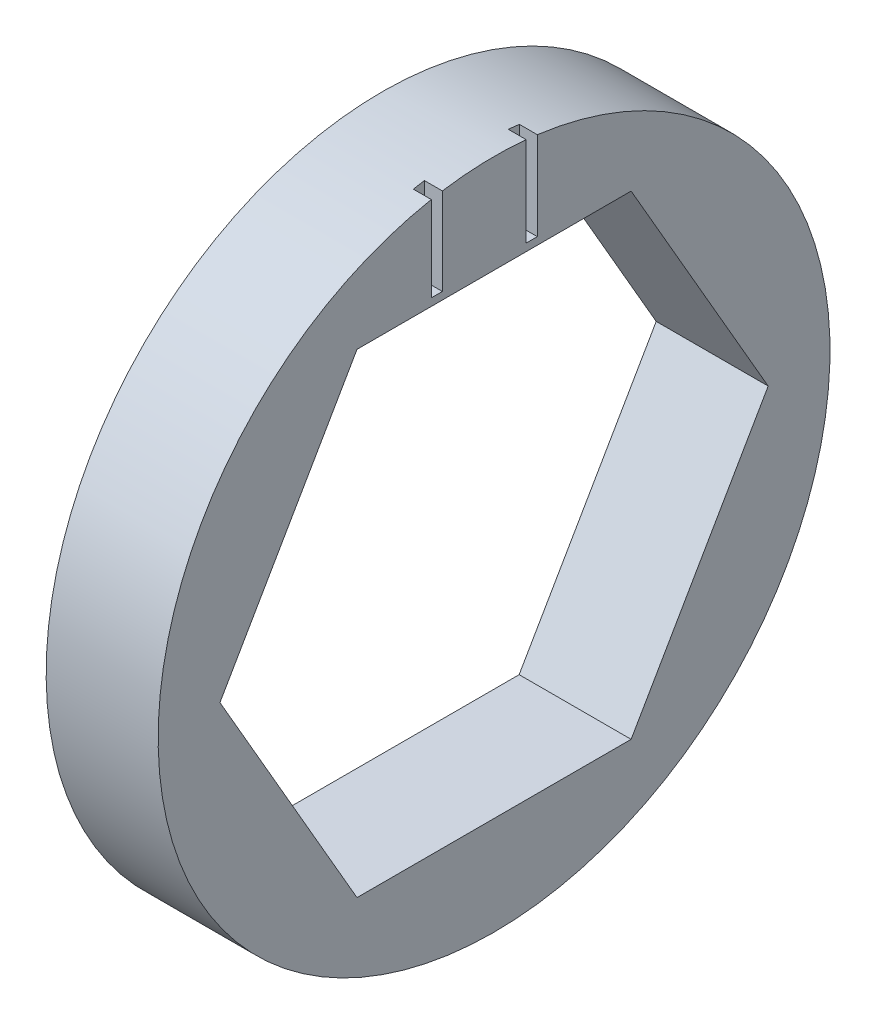
ISO-10303-21;
HEADER;
FILE_DESCRIPTION(('STEP AP214'),'2;1');
FILE_NAME('part.step','',(''),(''),'','','');
FILE_SCHEMA(('AUTOMOTIVE_DESIGN { 1 0 10303 214 1 1 1 1 }'));
ENDSEC;
DATA;
#1=APPLICATION_CONTEXT('core data for automotive mechanical design processes');
#2=APPLICATION_PROTOCOL_DEFINITION('international standard','automotive_design',2000,#1);
#3=PRODUCT_CONTEXT('',#1,'mechanical');
#4=PRODUCT('Part','Part','',(#3));
#5=PRODUCT_RELATED_PRODUCT_CATEGORY('part','',(#4));
#6=PRODUCT_DEFINITION_FORMATION('','',#4);
#7=PRODUCT_DEFINITION_CONTEXT('part definition',#1,'design');
#8=PRODUCT_DEFINITION('design','',#6,#7);
#9=PRODUCT_DEFINITION_SHAPE('','',#8);
#10=(LENGTH_UNIT() NAMED_UNIT(*) SI_UNIT(.MILLI.,.METRE.));
#11=(NAMED_UNIT(*) PLANE_ANGLE_UNIT() SI_UNIT($,.RADIAN.));
#12=(NAMED_UNIT(*) SI_UNIT($,.STERADIAN.) SOLID_ANGLE_UNIT());
#13=UNCERTAINTY_MEASURE_WITH_UNIT(LENGTH_MEASURE(1.E-05),#10,'distance_accuracy_value','');
#14=(GEOMETRIC_REPRESENTATION_CONTEXT(3) GLOBAL_UNCERTAINTY_ASSIGNED_CONTEXT((#13)) GLOBAL_UNIT_ASSIGNED_CONTEXT((#10,
#11,#12)) REPRESENTATION_CONTEXT('',''));
#15=CARTESIAN_POINT('',(0.,0.,0.));
#16=DIRECTION('',(0.,0.,1.));
#17=DIRECTION('',(1.,0.,0.));
#18=AXIS2_PLACEMENT_3D('',#15,#16,#17);
#19=CARTESIAN_POINT('',(3.175,0.,0.));
#20=DIRECTION('',(1.,0.,0.));
#21=DIRECTION('',(0.,0.,-1.));
#22=AXIS2_PLACEMENT_3D('',#19,#20,#21);
#23=PLANE('',#22);
#24=DIRECTION('',(0.,0.866025403784438,0.500000000000001));
#25=VECTOR('',#24,1.);
#26=CARTESIAN_POINT('',(3.175,0.,-7.77228932383071));
#27=LINE('',#26,#25);
#28=CARTESIAN_POINT('',(3.175,0.,-7.77228932383071));
#29=VERTEX_POINT('',#28);
#30=CARTESIAN_POINT('',(3.175,6.73099999999998,-3.88614466191534));
#31=VERTEX_POINT('',#30);
#32=EDGE_CURVE('E185',#29,#31,#27,.T.);
#33=ORIENTED_EDGE('',*,*,#32,.F.);
#34=DIRECTION('',(0.,0.866025403784442,-0.499999999999995));
#35=VECTOR('',#34,1.);
#36=CARTESIAN_POINT('',(3.175,-6.73099999999993,-3.88614466191543));
#37=LINE('',#36,#35);
#38=CARTESIAN_POINT('',(3.175,-6.73099999999993,-3.88614466191543));
#39=VERTEX_POINT('',#38);
#40=EDGE_CURVE('E183',#39,#29,#37,.T.);
#41=ORIENTED_EDGE('',*,*,#40,.F.);
#42=DIRECTION('',(0.,0.,-1.));
#43=VECTOR('',#42,1.);
#44=CARTESIAN_POINT('',(3.175,-6.73100000000001,3.88614466191529));
#45=LINE('',#44,#43);
#46=CARTESIAN_POINT('',(3.175,-6.73100000000001,3.88614466191529));
#47=VERTEX_POINT('',#46);
#48=EDGE_CURVE('E195',#47,#39,#45,.T.);
#49=ORIENTED_EDGE('',*,*,#48,.F.);
#50=DIRECTION('',(0.,-0.866025403784434,-0.500000000000007));
#51=VECTOR('',#50,1.);
#52=CARTESIAN_POINT('',(3.175,0.,7.77228932383071));
#53=LINE('',#52,#51);
#54=CARTESIAN_POINT('',(3.175,0.,7.77228932383071));
#55=VERTEX_POINT('',#54);
#56=EDGE_CURVE('E192',#55,#47,#53,.T.);
#57=ORIENTED_EDGE('',*,*,#56,.F.);
#58=DIRECTION('',(0.,-0.866025403784442,0.499999999999995));
#59=VECTOR('',#58,1.);
#60=CARTESIAN_POINT('',(3.175,6.73099999999996,3.88614466191539));
#61=LINE('',#60,#59);
#62=CARTESIAN_POINT('',(3.175,6.73099999999996,3.88614466191539));
#63=VERTEX_POINT('',#62);
#64=EDGE_CURVE('E190',#63,#55,#61,.T.);
#65=ORIENTED_EDGE('',*,*,#64,.F.);
#66=DIRECTION('',(0.,0.,1.));
#67=VECTOR('',#66,1.);
#68=CARTESIAN_POINT('',(3.175,6.73099999999998,-3.88614466191534));
#69=LINE('',#68,#67);
#70=EDGE_CURVE('E188',#31,#63,#69,.T.);
#71=ORIENTED_EDGE('',*,*,#70,.F.);
#72=EDGE_LOOP('',(#33,#41,#49,#57,#65,#71));
#73=FACE_BOUND('',#72,.T.);
#74=CARTESIAN_POINT('',(3.175,0.,0.));
#75=DIRECTION('',(1.,0.,0.));
#76=DIRECTION('',(0.,0.,-1.));
#77=AXIS2_PLACEMENT_3D('',#74,#75,#76);
#78=CIRCLE('',#77,9.525);
#79=CARTESIAN_POINT('',(3.175,9.48119971658039,-0.912401739540166));
#80=VERTEX_POINT('',#79);
#81=CARTESIAN_POINT('',(3.175,9.41153788845257,1.46580338866496));
#82=VERTEX_POINT('',#81);
#83=EDGE_CURVE('E231',#80,#82,#78,.T.);
#84=ORIENTED_EDGE('',*,*,#83,.T.);
#85=DIRECTION('',(0.,-1.,0.));
#86=VECTOR('',#85,1.);
#87=CARTESIAN_POINT('',(3.175,10.4424774226015,1.46580338866496));
#88=LINE('',#87,#86);
#89=CARTESIAN_POINT('',(3.175,6.94247742260146,1.46580338866496));
#90=VERTEX_POINT('',#89);
#91=EDGE_CURVE('E158',#82,#90,#88,.T.);
#92=ORIENTED_EDGE('',*,*,#91,.T.);
#93=DIRECTION('',(0.,0.,1.));
#94=VECTOR('',#93,1.);
#95=CARTESIAN_POINT('',(3.175,6.94247742260146,1.46580338866496));
#96=LINE('',#95,#94);
#97=CARTESIAN_POINT('',(3.175,6.94247742260146,1.77990595276753));
#98=VERTEX_POINT('',#97);
#99=EDGE_CURVE('E146',#90,#98,#96,.T.);
#100=ORIENTED_EDGE('',*,*,#99,.T.);
#101=DIRECTION('',(0.,1.,0.));
#102=VECTOR('',#101,1.);
#103=CARTESIAN_POINT('',(3.175,6.94247742260146,1.77990595276753));
#104=LINE('',#103,#102);
#105=CARTESIAN_POINT('',(3.175,9.35721966180675,1.77990595276753));
#106=VERTEX_POINT('',#105);
#107=EDGE_CURVE('E140',#98,#106,#104,.T.);
#108=ORIENTED_EDGE('',*,*,#107,.T.);
#109=CARTESIAN_POINT('',(3.175,9.4457033720706,-1.22650430364273));
#110=VERTEX_POINT('',#109);
#111=EDGE_CURVE('E228',#106,#110,#78,.T.);
#112=ORIENTED_EDGE('',*,*,#111,.T.);
#113=DIRECTION('',(0.,-1.,0.));
#114=VECTOR('',#113,1.);
#115=CARTESIAN_POINT('',(3.175,10.4424774226015,-1.22650430364273));
#116=LINE('',#115,#114);
#117=CARTESIAN_POINT('',(3.175,6.94247742260146,-1.22650430364273));
#118=VERTEX_POINT('',#117);
#119=EDGE_CURVE('E173',#110,#118,#116,.T.);
#120=ORIENTED_EDGE('',*,*,#119,.T.);
#121=DIRECTION('',(0.,0.,1.));
#122=VECTOR('',#121,1.);
#123=CARTESIAN_POINT('',(3.175,6.94247742260146,-1.22650430364273));
#124=LINE('',#123,#122);
#125=CARTESIAN_POINT('',(3.175,6.94247742260146,-0.912401739540166));
#126=VERTEX_POINT('',#125);
#127=EDGE_CURVE('E176',#118,#126,#124,.T.);
#128=ORIENTED_EDGE('',*,*,#127,.T.);
#129=DIRECTION('',(0.,1.,0.));
#130=VECTOR('',#129,1.);
#131=CARTESIAN_POINT('',(3.175,6.94247742260146,-0.912401739540166));
#132=LINE('',#131,#130);
#133=EDGE_CURVE('E167',#126,#80,#132,.T.);
#134=ORIENTED_EDGE('',*,*,#133,.T.);
#135=EDGE_LOOP('',(#84,#92,#100,#108,#112,#120,#128,#134));
#136=FACE_BOUND('',#135,.T.);
#137=ADVANCED_FACE('F35',(#73,#136),#23,.T.);
#138=CARTESIAN_POINT('',(3.175,0.,0.));
#139=DIRECTION('',(-1.,0.,0.));
#140=DIRECTION('',(0.,0.,1.));
#141=AXIS2_PLACEMENT_3D('',#138,#139,#140);
#142=CYLINDRICAL_SURFACE('',#141,9.525);
#143=CARTESIAN_POINT('',(0.,0.,0.));
#144=DIRECTION('',(1.,0.,0.));
#145=DIRECTION('',(0.,0.,-1.));
#146=AXIS2_PLACEMENT_3D('',#143,#144,#145);
#147=CIRCLE('',#146,9.525);
#148=CARTESIAN_POINT('',(0.,0.,-9.525));
#149=VERTEX_POINT('',#148);
#150=EDGE_CURVE('E227',#149,#149,#147,.T.);
#151=ORIENTED_EDGE('',*,*,#150,.T.);
#152=EDGE_LOOP('',(#151));
#153=FACE_BOUND('',#152,.T.);
#154=DIRECTION('',(-1.,0.,0.));
#155=VECTOR('',#154,1.);
#156=CARTESIAN_POINT('',(3.175,9.41153788845257,1.46580338866496));
#157=LINE('',#156,#155);
#158=CARTESIAN_POINT('',(2.667,9.41153788845257,1.46580338866496));
#159=VERTEX_POINT('',#158);
#160=EDGE_CURVE('E11',#82,#159,#157,.T.);
#161=ORIENTED_EDGE('',*,*,#160,.F.);
#162=ORIENTED_EDGE('',*,*,#83,.F.);
#163=DIRECTION('',(-1.,0.,0.));
#164=VECTOR('',#163,1.);
#165=CARTESIAN_POINT('',(3.175,9.48119971658039,-0.912401739540166));
#166=LINE('',#165,#164);
#167=CARTESIAN_POINT('',(2.667,9.48119971658039,-0.912401739540166));
#168=VERTEX_POINT('',#167);
#169=EDGE_CURVE('E237',#168,#80,#166,.F.);
#170=ORIENTED_EDGE('',*,*,#169,.F.);
#171=CARTESIAN_POINT('',(2.667,0.,0.));
#172=DIRECTION('',(-1.,0.,0.));
#173=DIRECTION('',(0.,0.,1.));
#174=AXIS2_PLACEMENT_3D('',#171,#172,#173);
#175=CIRCLE('',#174,9.525);
#176=CARTESIAN_POINT('',(2.667,9.4457033720706,-1.22650430364273));
#177=VERTEX_POINT('',#176);
#178=EDGE_CURVE('E234',#168,#177,#175,.T.);
#179=ORIENTED_EDGE('',*,*,#178,.T.);
#180=DIRECTION('',(-1.,0.,0.));
#181=VECTOR('',#180,1.);
#182=CARTESIAN_POINT('',(3.175,9.4457033720706,-1.22650430364273));
#183=LINE('',#182,#181);
#184=EDGE_CURVE('E239',#110,#177,#183,.T.);
#185=ORIENTED_EDGE('',*,*,#184,.F.);
#186=ORIENTED_EDGE('',*,*,#111,.F.);
#187=DIRECTION('',(-1.,0.,0.));
#188=VECTOR('',#187,1.);
#189=CARTESIAN_POINT('',(3.175,9.35721966180675,1.77990595276753));
#190=LINE('',#189,#188);
#191=CARTESIAN_POINT('',(2.667,9.35721966180675,1.77990595276753));
#192=VERTEX_POINT('',#191);
#193=EDGE_CURVE('E43',#192,#106,#190,.F.);
#194=ORIENTED_EDGE('',*,*,#193,.F.);
#195=CARTESIAN_POINT('',(2.667,0.,0.));
#196=DIRECTION('',(-1.,0.,0.));
#197=DIRECTION('',(0.,0.,1.));
#198=AXIS2_PLACEMENT_3D('',#195,#196,#197);
#199=CIRCLE('',#198,9.525);
#200=EDGE_CURVE('E241',#192,#159,#199,.T.);
#201=ORIENTED_EDGE('',*,*,#200,.T.);
#202=EDGE_LOOP('',(#161,#162,#170,#179,#185,#186,#194,#201));
#203=FACE_BOUND('',#202,.T.);
#204=ADVANCED_FACE('F37',(#153,#203),#142,.T.);
#205=CARTESIAN_POINT('',(0.,0.,0.));
#206=DIRECTION('',(1.,0.,0.));
#207=DIRECTION('',(0.,0.,-1.));
#208=AXIS2_PLACEMENT_3D('',#205,#206,#207);
#209=PLANE('',#208);
#210=ORIENTED_EDGE('',*,*,#150,.F.);
#211=EDGE_LOOP('',(#210));
#212=FACE_BOUND('',#211,.T.);
#213=DIRECTION('',(0.,0.866025403784442,-0.499999999999995));
#214=VECTOR('',#213,1.);
#215=CARTESIAN_POINT('',(0.,-6.73099999999993,-3.88614466191543));
#216=LINE('',#215,#214);
#217=CARTESIAN_POINT('',(0.,-6.73099999999993,-3.88614466191543));
#218=VERTEX_POINT('',#217);
#219=CARTESIAN_POINT('',(0.,0.,-7.77228932383071));
#220=VERTEX_POINT('',#219);
#221=EDGE_CURVE('E148',#218,#220,#216,.T.);
#222=ORIENTED_EDGE('',*,*,#221,.T.);
#223=DIRECTION('',(0.,0.866025403784438,0.500000000000001));
#224=VECTOR('',#223,1.);
#225=CARTESIAN_POINT('',(0.,0.,-7.77228932383071));
#226=LINE('',#225,#224);
#227=CARTESIAN_POINT('',(0.,6.73099999999998,-3.88614466191534));
#228=VERTEX_POINT('',#227);
#229=EDGE_CURVE('E200',#220,#228,#226,.T.);
#230=ORIENTED_EDGE('',*,*,#229,.T.);
#231=DIRECTION('',(0.,0.,1.));
#232=VECTOR('',#231,1.);
#233=CARTESIAN_POINT('',(0.,6.73099999999998,-3.88614466191534));
#234=LINE('',#233,#232);
#235=CARTESIAN_POINT('',(0.,6.73099999999996,3.88614466191539));
#236=VERTEX_POINT('',#235);
#237=EDGE_CURVE('E203',#228,#236,#234,.T.);
#238=ORIENTED_EDGE('',*,*,#237,.T.);
#239=DIRECTION('',(0.,-0.866025403784442,0.499999999999995));
#240=VECTOR('',#239,1.);
#241=CARTESIAN_POINT('',(0.,6.73099999999996,3.88614466191539));
#242=LINE('',#241,#240);
#243=CARTESIAN_POINT('',(0.,0.,7.77228932383071));
#244=VERTEX_POINT('',#243);
#245=EDGE_CURVE('E206',#236,#244,#242,.T.);
#246=ORIENTED_EDGE('',*,*,#245,.T.);
#247=DIRECTION('',(0.,-0.866025403784434,-0.500000000000007));
#248=VECTOR('',#247,1.);
#249=CARTESIAN_POINT('',(0.,0.,7.77228932383071));
#250=LINE('',#249,#248);
#251=CARTESIAN_POINT('',(0.,-6.73100000000001,3.88614466191529));
#252=VERTEX_POINT('',#251);
#253=EDGE_CURVE('E209',#244,#252,#250,.T.);
#254=ORIENTED_EDGE('',*,*,#253,.T.);
#255=DIRECTION('',(0.,0.,-1.));
#256=VECTOR('',#255,1.);
#257=CARTESIAN_POINT('',(0.,-6.73100000000001,3.88614466191529));
#258=LINE('',#257,#256);
#259=EDGE_CURVE('E186',#252,#218,#258,.T.);
#260=ORIENTED_EDGE('',*,*,#259,.T.);
#261=EDGE_LOOP('',(#222,#230,#238,#246,#254,#260));
#262=FACE_BOUND('',#261,.T.);
#263=ADVANCED_FACE('F281',(#212,#262),#209,.F.);
#264=CARTESIAN_POINT('',(3.175,-6.73099999999993,-3.88614466191543));
#265=DIRECTION('',(0.,0.499999999999995,0.866025403784441));
#266=DIRECTION('',(0.,-0.866025403784442,0.499999999999995));
#267=AXIS2_PLACEMENT_3D('',#264,#265,#266);
#268=PLANE('',#267);
#269=ORIENTED_EDGE('',*,*,#221,.F.);
#270=DIRECTION('',(-1.,0.,0.));
#271=VECTOR('',#270,1.);
#272=CARTESIAN_POINT('',(3.175,-6.73099999999993,-3.88614466191543));
#273=LINE('',#272,#271);
#274=EDGE_CURVE('E197',#39,#218,#273,.T.);
#275=ORIENTED_EDGE('',*,*,#274,.F.);
#276=ORIENTED_EDGE('',*,*,#40,.T.);
#277=DIRECTION('',(-1.,0.,0.));
#278=VECTOR('',#277,1.);
#279=CARTESIAN_POINT('',(3.175,0.,-7.77228932383071));
#280=LINE('',#279,#278);
#281=EDGE_CURVE('E224',#29,#220,#280,.T.);
#282=ORIENTED_EDGE('',*,*,#281,.T.);
#283=EDGE_LOOP('',(#269,#275,#276,#282));
#284=FACE_BOUND('',#283,.T.);
#285=ADVANCED_FACE('F285',(#284),#268,.T.);
#286=CARTESIAN_POINT('',(3.175,0.,-7.77228932383071));
#287=DIRECTION('',(0.,-0.500000000000001,0.866025403784438));
#288=DIRECTION('',(0.,-0.866025403784438,-0.500000000000001));
#289=AXIS2_PLACEMENT_3D('',#286,#287,#288);
#290=PLANE('',#289);
#291=ORIENTED_EDGE('',*,*,#229,.F.);
#292=ORIENTED_EDGE('',*,*,#281,.F.);
#293=ORIENTED_EDGE('',*,*,#32,.T.);
#294=DIRECTION('',(-1.,0.,0.));
#295=VECTOR('',#294,1.);
#296=CARTESIAN_POINT('',(3.175,6.73099999999998,-3.88614466191534));
#297=LINE('',#296,#295);
#298=EDGE_CURVE('E222',#31,#228,#297,.T.);
#299=ORIENTED_EDGE('',*,*,#298,.T.);
#300=EDGE_LOOP('',(#291,#292,#293,#299));
#301=FACE_BOUND('',#300,.T.);
#302=ADVANCED_FACE('F292',(#301),#290,.T.);
#303=CARTESIAN_POINT('',(3.175,6.73099999999998,-3.88614466191534));
#304=DIRECTION('',(0.,-1.,0.));
#305=DIRECTION('',(0.,0.,-1.));
#306=AXIS2_PLACEMENT_3D('',#303,#304,#305);
#307=PLANE('',#306);
#308=ORIENTED_EDGE('',*,*,#237,.F.);
#309=ORIENTED_EDGE('',*,*,#298,.F.);
#310=ORIENTED_EDGE('',*,*,#70,.T.);
#311=DIRECTION('',(-1.,0.,0.));
#312=VECTOR('',#311,1.);
#313=CARTESIAN_POINT('',(3.175,6.73099999999996,3.88614466191539));
#314=LINE('',#313,#312);
#315=EDGE_CURVE('E220',#63,#236,#314,.T.);
#316=ORIENTED_EDGE('',*,*,#315,.T.);
#317=EDGE_LOOP('',(#308,#309,#310,#316));
#318=FACE_BOUND('',#317,.T.);
#319=ADVANCED_FACE('F310',(#318),#307,.T.);
#320=CARTESIAN_POINT('',(3.175,6.73099999999996,3.88614466191539));
#321=DIRECTION('',(0.,-0.499999999999995,-0.866025403784442));
#322=DIRECTION('',(0.,0.866025403784442,-0.499999999999995));
#323=AXIS2_PLACEMENT_3D('',#320,#321,#322);
#324=PLANE('',#323);
#325=ORIENTED_EDGE('',*,*,#245,.F.);
#326=ORIENTED_EDGE('',*,*,#315,.F.);
#327=ORIENTED_EDGE('',*,*,#64,.T.);
#328=DIRECTION('',(-1.,0.,0.));
#329=VECTOR('',#328,1.);
#330=CARTESIAN_POINT('',(3.175,0.,7.77228932383071));
#331=LINE('',#330,#329);
#332=EDGE_CURVE('E218',#55,#244,#331,.T.);
#333=ORIENTED_EDGE('',*,*,#332,.T.);
#334=EDGE_LOOP('',(#325,#326,#327,#333));
#335=FACE_BOUND('',#334,.T.);
#336=ADVANCED_FACE('F315',(#335),#324,.T.);
#337=CARTESIAN_POINT('',(3.175,0.,7.77228932383071));
#338=DIRECTION('',(0.,0.500000000000007,-0.866025403784434));
#339=DIRECTION('',(0.,0.866025403784435,0.500000000000007));
#340=AXIS2_PLACEMENT_3D('',#337,#338,#339);
#341=PLANE('',#340);
#342=ORIENTED_EDGE('',*,*,#253,.F.);
#343=ORIENTED_EDGE('',*,*,#332,.F.);
#344=ORIENTED_EDGE('',*,*,#56,.T.);
#345=DIRECTION('',(-1.,0.,0.));
#346=VECTOR('',#345,1.);
#347=CARTESIAN_POINT('',(3.175,-6.73100000000001,3.88614466191529));
#348=LINE('',#347,#346);
#349=EDGE_CURVE('E216',#47,#252,#348,.T.);
#350=ORIENTED_EDGE('',*,*,#349,.T.);
#351=EDGE_LOOP('',(#342,#343,#344,#350));
#352=FACE_BOUND('',#351,.T.);
#353=ADVANCED_FACE('F318',(#352),#341,.T.);
#354=CARTESIAN_POINT('',(3.175,-6.73100000000001,3.88614466191529));
#355=DIRECTION('',(0.,1.,0.));
#356=DIRECTION('',(0.,0.,1.));
#357=AXIS2_PLACEMENT_3D('',#354,#355,#356);
#358=PLANE('',#357);
#359=ORIENTED_EDGE('',*,*,#259,.F.);
#360=ORIENTED_EDGE('',*,*,#349,.F.);
#361=ORIENTED_EDGE('',*,*,#48,.T.);
#362=ORIENTED_EDGE('',*,*,#274,.T.);
#363=EDGE_LOOP('',(#359,#360,#361,#362));
#364=FACE_BOUND('',#363,.T.);
#365=ADVANCED_FACE('F301',(#364),#358,.T.);
#366=CARTESIAN_POINT('',(2.667,10.4424774226015,-1.22650430364273));
#367=DIRECTION('',(0.,0.,1.));
#368=DIRECTION('',(1.,0.,0.));
#369=AXIS2_PLACEMENT_3D('',#366,#367,#368);
#370=PLANE('',#369);
#371=ORIENTED_EDGE('',*,*,#184,.T.);
#372=DIRECTION('',(0.,-1.,0.));
#373=VECTOR('',#372,1.);
#374=CARTESIAN_POINT('',(2.667,10.4424774226015,-1.22650430364273));
#375=LINE('',#374,#373);
#376=CARTESIAN_POINT('',(2.667,6.94247742260146,-1.22650430364273));
#377=VERTEX_POINT('',#376);
#378=EDGE_CURVE('E57',#177,#377,#375,.T.);
#379=ORIENTED_EDGE('',*,*,#378,.T.);
#380=DIRECTION('',(1.,0.,0.));
#381=VECTOR('',#380,1.);
#382=CARTESIAN_POINT('',(2.667,6.94247742260146,-1.22650430364273));
#383=LINE('',#382,#381);
#384=EDGE_CURVE('E160',#377,#118,#383,.T.);
#385=ORIENTED_EDGE('',*,*,#384,.T.);
#386=ORIENTED_EDGE('',*,*,#119,.F.);
#387=EDGE_LOOP('',(#371,#379,#385,#386));
#388=FACE_BOUND('',#387,.T.);
#389=ADVANCED_FACE('F253',(#388),#370,.T.);
#390=CARTESIAN_POINT('',(2.667,6.94247742260146,-0.912401739540166));
#391=DIRECTION('',(0.,0.,-1.));
#392=DIRECTION('',(-1.,0.,0.));
#393=AXIS2_PLACEMENT_3D('',#390,#391,#392);
#394=PLANE('',#393);
#395=ORIENTED_EDGE('',*,*,#169,.T.);
#396=ORIENTED_EDGE('',*,*,#133,.F.);
#397=DIRECTION('',(1.,0.,0.));
#398=VECTOR('',#397,1.);
#399=CARTESIAN_POINT('',(2.667,6.94247742260146,-0.912401739540166));
#400=LINE('',#399,#398);
#401=CARTESIAN_POINT('',(2.667,6.94247742260146,-0.912401739540166));
#402=VERTEX_POINT('',#401);
#403=EDGE_CURVE('E172',#402,#126,#400,.T.);
#404=ORIENTED_EDGE('',*,*,#403,.F.);
#405=DIRECTION('',(0.,1.,0.));
#406=VECTOR('',#405,1.);
#407=CARTESIAN_POINT('',(2.667,6.94247742260146,-0.912401739540166));
#408=LINE('',#407,#406);
#409=EDGE_CURVE('E169',#402,#168,#408,.T.);
#410=ORIENTED_EDGE('',*,*,#409,.T.);
#411=EDGE_LOOP('',(#395,#396,#404,#410));
#412=FACE_BOUND('',#411,.T.);
#413=ADVANCED_FACE('F263',(#412),#394,.T.);
#414=CARTESIAN_POINT('',(2.667,0.,0.));
#415=DIRECTION('',(-1.,0.,0.));
#416=DIRECTION('',(0.,0.,1.));
#417=AXIS2_PLACEMENT_3D('',#414,#415,#416);
#418=PLANE('',#417);
#419=ORIENTED_EDGE('',*,*,#409,.F.);
#420=DIRECTION('',(0.,0.,1.));
#421=VECTOR('',#420,1.);
#422=CARTESIAN_POINT('',(2.667,6.94247742260146,-1.22650430364273));
#423=LINE('',#422,#421);
#424=EDGE_CURVE('E166',#377,#402,#423,.T.);
#425=ORIENTED_EDGE('',*,*,#424,.F.);
#426=ORIENTED_EDGE('',*,*,#378,.F.);
#427=ORIENTED_EDGE('',*,*,#178,.F.);
#428=EDGE_LOOP('',(#419,#425,#426,#427));
#429=FACE_BOUND('',#428,.T.);
#430=ADVANCED_FACE('F264',(#429),#418,.F.);
#431=CARTESIAN_POINT('',(2.667,6.94247742260146,-1.22650430364273));
#432=DIRECTION('',(0.,1.,0.));
#433=DIRECTION('',(0.,0.,1.));
#434=AXIS2_PLACEMENT_3D('',#431,#432,#433);
#435=PLANE('',#434);
#436=ORIENTED_EDGE('',*,*,#127,.F.);
#437=ORIENTED_EDGE('',*,*,#384,.F.);
#438=ORIENTED_EDGE('',*,*,#424,.T.);
#439=ORIENTED_EDGE('',*,*,#403,.T.);
#440=EDGE_LOOP('',(#436,#437,#438,#439));
#441=FACE_BOUND('',#440,.T.);
#442=ADVANCED_FACE('F259',(#441),#435,.T.);
#443=CARTESIAN_POINT('',(2.667,10.4424774226015,1.46580338866496));
#444=DIRECTION('',(0.,0.,1.));
#445=DIRECTION('',(1.,0.,0.));
#446=AXIS2_PLACEMENT_3D('',#443,#444,#445);
#447=PLANE('',#446);
#448=ORIENTED_EDGE('',*,*,#160,.T.);
#449=DIRECTION('',(0.,-1.,0.));
#450=VECTOR('',#449,1.);
#451=CARTESIAN_POINT('',(2.667,10.4424774226015,1.46580338866496));
#452=LINE('',#451,#450);
#453=CARTESIAN_POINT('',(2.667,6.94247742260146,1.46580338866496));
#454=VERTEX_POINT('',#453);
#455=EDGE_CURVE('E50',#159,#454,#452,.T.);
#456=ORIENTED_EDGE('',*,*,#455,.T.);
#457=DIRECTION('',(1.,0.,0.));
#458=VECTOR('',#457,1.);
#459=CARTESIAN_POINT('',(2.667,6.94247742260146,1.46580338866496));
#460=LINE('',#459,#458);
#461=EDGE_CURVE('E135',#454,#90,#460,.T.);
#462=ORIENTED_EDGE('',*,*,#461,.T.);
#463=ORIENTED_EDGE('',*,*,#91,.F.);
#464=EDGE_LOOP('',(#448,#456,#462,#463));
#465=FACE_BOUND('',#464,.T.);
#466=ADVANCED_FACE('F134',(#465),#447,.T.);
#467=CARTESIAN_POINT('',(2.667,6.94247742260146,1.77990595276753));
#468=DIRECTION('',(0.,0.,-1.));
#469=DIRECTION('',(-1.,0.,0.));
#470=AXIS2_PLACEMENT_3D('',#467,#468,#469);
#471=PLANE('',#470);
#472=ORIENTED_EDGE('',*,*,#193,.T.);
#473=ORIENTED_EDGE('',*,*,#107,.F.);
#474=DIRECTION('',(1.,0.,0.));
#475=VECTOR('',#474,1.);
#476=CARTESIAN_POINT('',(2.667,6.94247742260146,1.77990595276753));
#477=LINE('',#476,#475);
#478=CARTESIAN_POINT('',(2.667,6.94247742260146,1.77990595276753));
#479=VERTEX_POINT('',#478);
#480=EDGE_CURVE('E149',#479,#98,#477,.T.);
#481=ORIENTED_EDGE('',*,*,#480,.F.);
#482=DIRECTION('',(0.,1.,0.));
#483=VECTOR('',#482,1.);
#484=CARTESIAN_POINT('',(2.667,6.94247742260146,1.77990595276753));
#485=LINE('',#484,#483);
#486=EDGE_CURVE('E154',#479,#192,#485,.T.);
#487=ORIENTED_EDGE('',*,*,#486,.T.);
#488=EDGE_LOOP('',(#472,#473,#481,#487));
#489=FACE_BOUND('',#488,.T.);
#490=ADVANCED_FACE('F245',(#489),#471,.T.);
#491=CARTESIAN_POINT('',(2.667,0.,0.));
#492=DIRECTION('',(-1.,0.,0.));
#493=DIRECTION('',(0.,0.,1.));
#494=AXIS2_PLACEMENT_3D('',#491,#492,#493);
#495=PLANE('',#494);
#496=ORIENTED_EDGE('',*,*,#486,.F.);
#497=DIRECTION('',(0.,0.,1.));
#498=VECTOR('',#497,1.);
#499=CARTESIAN_POINT('',(2.667,6.94247742260146,1.46580338866496));
#500=LINE('',#499,#498);
#501=EDGE_CURVE('E139',#454,#479,#500,.T.);
#502=ORIENTED_EDGE('',*,*,#501,.F.);
#503=ORIENTED_EDGE('',*,*,#455,.F.);
#504=ORIENTED_EDGE('',*,*,#200,.F.);
#505=EDGE_LOOP('',(#496,#502,#503,#504));
#506=FACE_BOUND('',#505,.T.);
#507=ADVANCED_FACE('F152',(#506),#495,.F.);
#508=CARTESIAN_POINT('',(2.667,6.94247742260146,1.46580338866496));
#509=DIRECTION('',(0.,1.,0.));
#510=DIRECTION('',(0.,0.,1.));
#511=AXIS2_PLACEMENT_3D('',#508,#509,#510);
#512=PLANE('',#511);
#513=ORIENTED_EDGE('',*,*,#99,.F.);
#514=ORIENTED_EDGE('',*,*,#461,.F.);
#515=ORIENTED_EDGE('',*,*,#501,.T.);
#516=ORIENTED_EDGE('',*,*,#480,.T.);
#517=EDGE_LOOP('',(#513,#514,#515,#516));
#518=FACE_BOUND('',#517,.T.);
#519=ADVANCED_FACE('F143',(#518),#512,.T.);
#520=CLOSED_SHELL('',(#137,#204,#263,#285,#302,#319,#336,#353,#365,#389,#413,#430,#442,#466,
#490,#507,#519));
#521=MANIFOLD_SOLID_BREP('B2',#520);
#522=ADVANCED_BREP_SHAPE_REPRESENTATION('',(#18,#521),#14);
#523=SHAPE_DEFINITION_REPRESENTATION(#9,#522);
ENDSEC;
END-ISO-10303-21;
